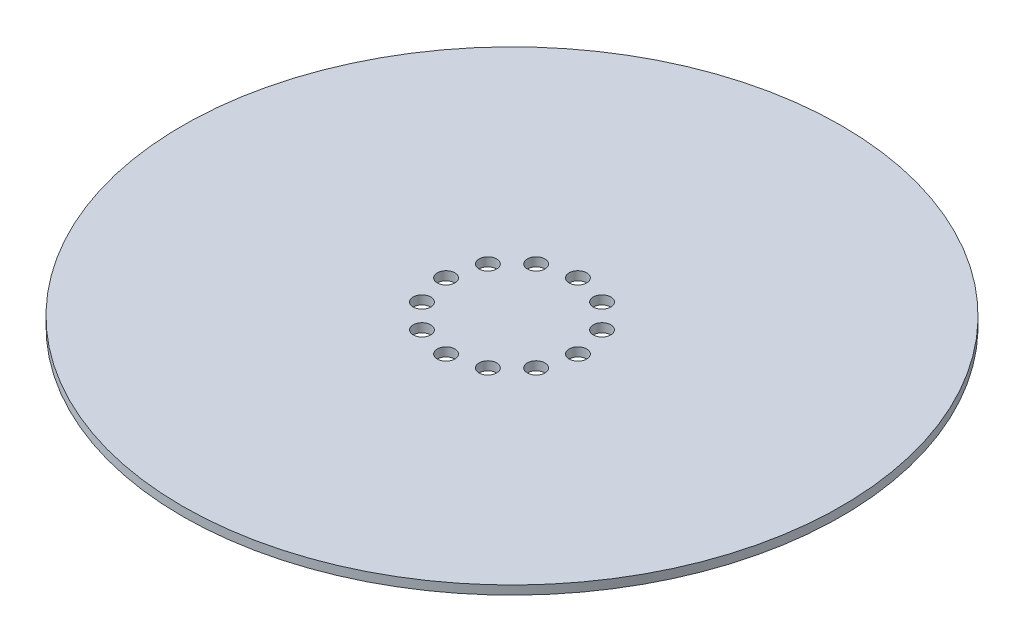
ISO-10303-21;
HEADER;
FILE_DESCRIPTION(('STEP AP214'),'2;1');
FILE_NAME('part.step','',(''),(''),'','','');
FILE_SCHEMA(('AUTOMOTIVE_DESIGN { 1 0 10303 214 1 1 1 1 }'));
ENDSEC;
DATA;
#1=APPLICATION_CONTEXT('core data for automotive mechanical design processes');
#2=APPLICATION_PROTOCOL_DEFINITION('international standard','automotive_design',2000,#1);
#3=PRODUCT_CONTEXT('',#1,'mechanical');
#4=PRODUCT('Part','Part','',(#3));
#5=PRODUCT_RELATED_PRODUCT_CATEGORY('part','',(#4));
#6=PRODUCT_DEFINITION_FORMATION('','',#4);
#7=PRODUCT_DEFINITION_CONTEXT('part definition',#1,'design');
#8=PRODUCT_DEFINITION('design','',#6,#7);
#9=PRODUCT_DEFINITION_SHAPE('','',#8);
#10=(LENGTH_UNIT() NAMED_UNIT(*) SI_UNIT(.MILLI.,.METRE.));
#11=(NAMED_UNIT(*) PLANE_ANGLE_UNIT() SI_UNIT($,.RADIAN.));
#12=(NAMED_UNIT(*) SI_UNIT($,.STERADIAN.) SOLID_ANGLE_UNIT());
#13=UNCERTAINTY_MEASURE_WITH_UNIT(LENGTH_MEASURE(1.E-05),#10,'distance_accuracy_value','');
#14=(GEOMETRIC_REPRESENTATION_CONTEXT(3) GLOBAL_UNCERTAINTY_ASSIGNED_CONTEXT((#13)) GLOBAL_UNIT_ASSIGNED_CONTEXT((#10,
#11,#12)) REPRESENTATION_CONTEXT('',''));
#15=CARTESIAN_POINT('',(0.,0.,0.));
#16=DIRECTION('',(0.,0.,1.));
#17=DIRECTION('',(1.,0.,0.));
#18=AXIS2_PLACEMENT_3D('',#15,#16,#17);
#19=CARTESIAN_POINT('',(0.,8.,0.));
#20=DIRECTION('',(0.,-1.,0.));
#21=DIRECTION('',(0.,0.,-1.));
#22=AXIS2_PLACEMENT_3D('',#19,#20,#21);
#23=CYLINDRICAL_SURFACE('',#22,300.);
#24=CARTESIAN_POINT('',(0.,8.,0.));
#25=DIRECTION('',(0.,1.,0.));
#26=DIRECTION('',(0.,0.,1.));
#27=AXIS2_PLACEMENT_3D('',#24,#25,#26);
#28=CIRCLE('',#27,300.);
#29=CARTESIAN_POINT('',(0.,8.,300.));
#30=VERTEX_POINT('',#29);
#31=EDGE_CURVE('E11',#30,#30,#28,.T.);
#32=ORIENTED_EDGE('',*,*,#31,.F.);
#33=EDGE_LOOP('',(#32));
#34=FACE_BOUND('',#33,.T.);
#35=CARTESIAN_POINT('',(0.,0.,0.));
#36=DIRECTION('',(0.,1.,0.));
#37=DIRECTION('',(0.,0.,1.));
#38=AXIS2_PLACEMENT_3D('',#35,#36,#37);
#39=CIRCLE('',#38,300.);
#40=CARTESIAN_POINT('',(0.,0.,300.));
#41=VERTEX_POINT('',#40);
#42=EDGE_CURVE('E36',#41,#41,#39,.T.);
#43=ORIENTED_EDGE('',*,*,#42,.T.);
#44=EDGE_LOOP('',(#43));
#45=FACE_BOUND('',#44,.T.);
#46=ADVANCED_FACE('F33',(#34,#45),#23,.T.);
#47=CARTESIAN_POINT('',(0.,8.,0.));
#48=DIRECTION('',(0.,1.,0.));
#49=DIRECTION('',(0.,0.,1.));
#50=AXIS2_PLACEMENT_3D('',#47,#48,#49);
#51=PLANE('',#50);
#52=CARTESIAN_POINT('',(-51.9615242270625,8.,-30.0000000000022));
#53=DIRECTION('',(0.,-1.,0.));
#54=DIRECTION('',(0.,0.,-1.));
#55=AXIS2_PLACEMENT_3D('',#52,#53,#54);
#56=CIRCLE('',#55,8.);
#57=CARTESIAN_POINT('',(-51.9615242270625,8.,-38.0000000000022));
#58=VERTEX_POINT('',#57);
#59=EDGE_CURVE('E108',#58,#58,#56,.T.);
#60=ORIENTED_EDGE('',*,*,#59,.T.);
#61=EDGE_LOOP('',(#60));
#62=FACE_BOUND('',#61,.T.);
#63=CARTESIAN_POINT('',(-29.9999999999952,8.,-51.9615242270676));
#64=DIRECTION('',(0.,-1.,0.));
#65=DIRECTION('',(0.,0.,-1.));
#66=AXIS2_PLACEMENT_3D('',#63,#64,#65);
#67=CIRCLE('',#66,8.);
#68=CARTESIAN_POINT('',(-29.9999999999952,8.,-59.9615242270676));
#69=VERTEX_POINT('',#68);
#70=EDGE_CURVE('E116',#69,#69,#67,.T.);
#71=ORIENTED_EDGE('',*,*,#70,.T.);
#72=EDGE_LOOP('',(#71));
#73=FACE_BOUND('',#72,.T.);
#74=CARTESIAN_POINT('',(5.10121193588295E-12,8.,-60.));
#75=DIRECTION('',(0.,-1.,0.));
#76=DIRECTION('',(0.,0.,-1.));
#77=AXIS2_PLACEMENT_3D('',#74,#75,#76);
#78=CIRCLE('',#77,8.);
#79=CARTESIAN_POINT('',(5.10121193588295E-12,8.,-68.));
#80=VERTEX_POINT('',#79);
#81=EDGE_CURVE('E122',#80,#80,#78,.T.);
#82=ORIENTED_EDGE('',*,*,#81,.T.);
#83=EDGE_LOOP('',(#82));
#84=FACE_BOUND('',#83,.T.);
#85=CARTESIAN_POINT('',(30.0000000000048,8.,-51.961524227065));
#86=DIRECTION('',(0.,-1.,0.));
#87=DIRECTION('',(0.,0.,-1.));
#88=AXIS2_PLACEMENT_3D('',#85,#86,#87);
#89=CIRCLE('',#88,8.);
#90=CARTESIAN_POINT('',(30.0000000000048,8.,-59.961524227065));
#91=VERTEX_POINT('',#90);
#92=EDGE_CURVE('E68',#91,#91,#89,.T.);
#93=ORIENTED_EDGE('',*,*,#92,.T.);
#94=EDGE_LOOP('',(#93));
#95=FACE_BOUND('',#94,.T.);
#96=CARTESIAN_POINT('',(51.9615242270702,8.,-29.9999999999978));
#97=DIRECTION('',(0.,-1.,0.));
#98=DIRECTION('',(0.,0.,-1.));
#99=AXIS2_PLACEMENT_3D('',#96,#97,#98);
#100=CIRCLE('',#99,8.);
#101=CARTESIAN_POINT('',(51.9615242270702,8.,-37.9999999999978));
#102=VERTEX_POINT('',#101);
#103=EDGE_CURVE('E81',#102,#102,#100,.T.);
#104=ORIENTED_EDGE('',*,*,#103,.T.);
#105=EDGE_LOOP('',(#104));
#106=FACE_BOUND('',#105,.T.);
#107=CARTESIAN_POINT('',(60.0000000000025,8.,2.55060596794148E-12));
#108=DIRECTION('',(0.,-1.,0.));
#109=DIRECTION('',(0.,0.,-1.));
#110=AXIS2_PLACEMENT_3D('',#107,#108,#109);
#111=CIRCLE('',#110,8.00000000000001);
#112=CARTESIAN_POINT('',(60.0000000000025,8.,-7.99999999999746));
#113=VERTEX_POINT('',#112);
#114=EDGE_CURVE('E87',#113,#113,#111,.T.);
#115=ORIENTED_EDGE('',*,*,#114,.T.);
#116=EDGE_LOOP('',(#115));
#117=FACE_BOUND('',#116,.T.);
#118=CARTESIAN_POINT('',(51.9615242270676,8.,30.0000000000022));
#119=DIRECTION('',(0.,-1.,0.));
#120=DIRECTION('',(0.,0.,-1.));
#121=AXIS2_PLACEMENT_3D('',#118,#119,#120);
#122=CIRCLE('',#121,8.);
#123=CARTESIAN_POINT('',(51.9615242270676,8.,22.0000000000022));
#124=VERTEX_POINT('',#123);
#125=EDGE_CURVE('E94',#124,#124,#122,.T.);
#126=ORIENTED_EDGE('',*,*,#125,.T.);
#127=EDGE_LOOP('',(#126));
#128=FACE_BOUND('',#127,.T.);
#129=CARTESIAN_POINT('',(30.0000000000001,8.,51.9615242270663));
#130=DIRECTION('',(0.,-1.,0.));
#131=DIRECTION('',(0.,0.,-1.));
#132=AXIS2_PLACEMENT_3D('',#129,#130,#131);
#133=CIRCLE('',#132,8.);
#134=CARTESIAN_POINT('',(30.0000000000001,8.,43.9615242270663));
#135=VERTEX_POINT('',#134);
#136=EDGE_CURVE('E48',#135,#135,#133,.T.);
#137=ORIENTED_EDGE('',*,*,#136,.T.);
#138=EDGE_LOOP('',(#137));
#139=FACE_BOUND('',#138,.T.);
#140=CARTESIAN_POINT('',(-59.9999999999974,8.,-2.55795384873636E-12));
#141=DIRECTION('',(0.,-1.,0.));
#142=DIRECTION('',(0.,0.,-1.));
#143=AXIS2_PLACEMENT_3D('',#140,#141,#142);
#144=CIRCLE('',#143,8.);
#145=CARTESIAN_POINT('',(-59.9999999999974,8.,-8.00000000000256));
#146=VERTEX_POINT('',#145);
#147=EDGE_CURVE('E109',#146,#146,#144,.T.);
#148=ORIENTED_EDGE('',*,*,#147,.T.);
#149=EDGE_LOOP('',(#148));
#150=FACE_BOUND('',#149,.T.);
#151=CARTESIAN_POINT('',(-51.9615242270651,8.,29.9999999999978));
#152=DIRECTION('',(0.,-1.,0.));
#153=DIRECTION('',(0.,0.,-1.));
#154=AXIS2_PLACEMENT_3D('',#151,#152,#153);
#155=CIRCLE('',#154,8.);
#156=CARTESIAN_POINT('',(-51.9615242270651,8.,21.9999999999978));
#157=VERTEX_POINT('',#156);
#158=EDGE_CURVE('E222',#157,#157,#155,.T.);
#159=ORIENTED_EDGE('',*,*,#158,.T.);
#160=EDGE_LOOP('',(#159));
#161=FACE_BOUND('',#160,.T.);
#162=CARTESIAN_POINT('',(-29.9999999999997,8.,51.961524227065));
#163=DIRECTION('',(0.,-1.,0.));
#164=DIRECTION('',(0.,0.,-1.));
#165=AXIS2_PLACEMENT_3D('',#162,#163,#164);
#166=CIRCLE('',#165,8.);
#167=CARTESIAN_POINT('',(-29.9999999999997,8.,43.961524227065));
#168=VERTEX_POINT('',#167);
#169=EDGE_CURVE('E59',#168,#168,#166,.T.);
#170=ORIENTED_EDGE('',*,*,#169,.T.);
#171=EDGE_LOOP('',(#170));
#172=FACE_BOUND('',#171,.T.);
#173=CARTESIAN_POINT('',(0.,8.,60.));
#174=DIRECTION('',(0.,-1.,0.));
#175=DIRECTION('',(0.,0.,-1.));
#176=AXIS2_PLACEMENT_3D('',#173,#174,#175);
#177=CIRCLE('',#176,8.);
#178=CARTESIAN_POINT('',(0.,8.,52.));
#179=VERTEX_POINT('',#178);
#180=EDGE_CURVE('E42',#179,#179,#177,.T.);
#181=ORIENTED_EDGE('',*,*,#180,.T.);
#182=EDGE_LOOP('',(#181));
#183=FACE_BOUND('',#182,.T.);
#184=ORIENTED_EDGE('',*,*,#31,.T.);
#185=EDGE_LOOP('',(#184));
#186=FACE_BOUND('',#185,.T.);
#187=ADVANCED_FACE('F136',(#62,#73,#84,#95,#106,#117,#128,#139,#150,#161,#172,#183,#186),#51,.T.);
#188=CARTESIAN_POINT('',(0.,0.,0.));
#189=DIRECTION('',(0.,1.,0.));
#190=DIRECTION('',(0.,0.,1.));
#191=AXIS2_PLACEMENT_3D('',#188,#189,#190);
#192=PLANE('',#191);
#193=CARTESIAN_POINT('',(-51.9615242270625,0.,-30.0000000000022));
#194=DIRECTION('',(0.,-1.,0.));
#195=DIRECTION('',(0.,0.,-1.));
#196=AXIS2_PLACEMENT_3D('',#193,#194,#195);
#197=CIRCLE('',#196,8.);
#198=CARTESIAN_POINT('',(-51.9615242270625,0.,-38.0000000000022));
#199=VERTEX_POINT('',#198);
#200=EDGE_CURVE('E105',#199,#199,#197,.T.);
#201=ORIENTED_EDGE('',*,*,#200,.F.);
#202=EDGE_LOOP('',(#201));
#203=FACE_BOUND('',#202,.T.);
#204=CARTESIAN_POINT('',(-29.9999999999952,0.,-51.9615242270676));
#205=DIRECTION('',(0.,-1.,0.));
#206=DIRECTION('',(0.,0.,-1.));
#207=AXIS2_PLACEMENT_3D('',#204,#205,#206);
#208=CIRCLE('',#207,8.);
#209=CARTESIAN_POINT('',(-29.9999999999952,0.,-59.9615242270676));
#210=VERTEX_POINT('',#209);
#211=EDGE_CURVE('E113',#210,#210,#208,.T.);
#212=ORIENTED_EDGE('',*,*,#211,.F.);
#213=EDGE_LOOP('',(#212));
#214=FACE_BOUND('',#213,.T.);
#215=CARTESIAN_POINT('',(5.10121193588295E-12,0.,-60.));
#216=DIRECTION('',(0.,-1.,0.));
#217=DIRECTION('',(0.,0.,-1.));
#218=AXIS2_PLACEMENT_3D('',#215,#216,#217);
#219=CIRCLE('',#218,8.);
#220=CARTESIAN_POINT('',(5.10121193588295E-12,0.,-68.));
#221=VERTEX_POINT('',#220);
#222=EDGE_CURVE('E120',#221,#221,#219,.T.);
#223=ORIENTED_EDGE('',*,*,#222,.F.);
#224=EDGE_LOOP('',(#223));
#225=FACE_BOUND('',#224,.T.);
#226=CARTESIAN_POINT('',(30.0000000000048,0.,-51.961524227065));
#227=DIRECTION('',(0.,-1.,0.));
#228=DIRECTION('',(0.,0.,-1.));
#229=AXIS2_PLACEMENT_3D('',#226,#227,#228);
#230=CIRCLE('',#229,8.);
#231=CARTESIAN_POINT('',(30.0000000000048,0.,-59.961524227065));
#232=VERTEX_POINT('',#231);
#233=EDGE_CURVE('E72',#232,#232,#230,.T.);
#234=ORIENTED_EDGE('',*,*,#233,.F.);
#235=EDGE_LOOP('',(#234));
#236=FACE_BOUND('',#235,.T.);
#237=CARTESIAN_POINT('',(51.9615242270702,0.,-29.9999999999978));
#238=DIRECTION('',(0.,-1.,0.));
#239=DIRECTION('',(0.,0.,-1.));
#240=AXIS2_PLACEMENT_3D('',#237,#238,#239);
#241=CIRCLE('',#240,8.);
#242=CARTESIAN_POINT('',(51.9615242270702,0.,-37.9999999999978));
#243=VERTEX_POINT('',#242);
#244=EDGE_CURVE('E52',#243,#243,#241,.T.);
#245=ORIENTED_EDGE('',*,*,#244,.F.);
#246=EDGE_LOOP('',(#245));
#247=FACE_BOUND('',#246,.T.);
#248=CARTESIAN_POINT('',(60.0000000000025,0.,2.55060596794148E-12));
#249=DIRECTION('',(0.,-1.,0.));
#250=DIRECTION('',(0.,0.,-1.));
#251=AXIS2_PLACEMENT_3D('',#248,#249,#250);
#252=CIRCLE('',#251,8.00000000000001);
#253=CARTESIAN_POINT('',(60.0000000000025,0.,-7.99999999999746));
#254=VERTEX_POINT('',#253);
#255=EDGE_CURVE('E85',#254,#254,#252,.T.);
#256=ORIENTED_EDGE('',*,*,#255,.F.);
#257=EDGE_LOOP('',(#256));
#258=FACE_BOUND('',#257,.T.);
#259=CARTESIAN_POINT('',(51.9615242270676,0.,30.0000000000022));
#260=DIRECTION('',(0.,-1.,0.));
#261=DIRECTION('',(0.,0.,-1.));
#262=AXIS2_PLACEMENT_3D('',#259,#260,#261);
#263=CIRCLE('',#262,8.);
#264=CARTESIAN_POINT('',(51.9615242270676,0.,22.0000000000022));
#265=VERTEX_POINT('',#264);
#266=EDGE_CURVE('E91',#265,#265,#263,.T.);
#267=ORIENTED_EDGE('',*,*,#266,.F.);
#268=EDGE_LOOP('',(#267));
#269=FACE_BOUND('',#268,.T.);
#270=CARTESIAN_POINT('',(30.0000000000001,0.,51.9615242270663));
#271=DIRECTION('',(0.,-1.,0.));
#272=DIRECTION('',(0.,0.,-1.));
#273=AXIS2_PLACEMENT_3D('',#270,#271,#272);
#274=CIRCLE('',#273,8.);
#275=CARTESIAN_POINT('',(30.0000000000001,0.,43.9615242270663));
#276=VERTEX_POINT('',#275);
#277=EDGE_CURVE('E98',#276,#276,#274,.T.);
#278=ORIENTED_EDGE('',*,*,#277,.F.);
#279=EDGE_LOOP('',(#278));
#280=FACE_BOUND('',#279,.T.);
#281=CARTESIAN_POINT('',(-59.9999999999974,0.,-2.55795384873636E-12));
#282=DIRECTION('',(0.,-1.,0.));
#283=DIRECTION('',(0.,0.,-1.));
#284=AXIS2_PLACEMENT_3D('',#281,#282,#283);
#285=CIRCLE('',#284,8.);
#286=CARTESIAN_POINT('',(-59.9999999999974,0.,-8.00000000000256));
#287=VERTEX_POINT('',#286);
#288=EDGE_CURVE('E151',#287,#287,#285,.T.);
#289=ORIENTED_EDGE('',*,*,#288,.F.);
#290=EDGE_LOOP('',(#289));
#291=FACE_BOUND('',#290,.T.);
#292=CARTESIAN_POINT('',(-51.9615242270651,0.,29.9999999999978));
#293=DIRECTION('',(0.,-1.,0.));
#294=DIRECTION('',(0.,0.,-1.));
#295=AXIS2_PLACEMENT_3D('',#292,#293,#294);
#296=CIRCLE('',#295,8.);
#297=CARTESIAN_POINT('',(-51.9615242270651,0.,21.9999999999978));
#298=VERTEX_POINT('',#297);
#299=EDGE_CURVE('E64',#298,#298,#296,.T.);
#300=ORIENTED_EDGE('',*,*,#299,.F.);
#301=EDGE_LOOP('',(#300));
#302=FACE_BOUND('',#301,.T.);
#303=CARTESIAN_POINT('',(-29.9999999999997,0.,51.961524227065));
#304=DIRECTION('',(0.,-1.,0.));
#305=DIRECTION('',(0.,0.,-1.));
#306=AXIS2_PLACEMENT_3D('',#303,#304,#305);
#307=CIRCLE('',#306,8.);
#308=CARTESIAN_POINT('',(-29.9999999999997,0.,43.961524227065));
#309=VERTEX_POINT('',#308);
#310=EDGE_CURVE('E65',#309,#309,#307,.T.);
#311=ORIENTED_EDGE('',*,*,#310,.F.);
#312=EDGE_LOOP('',(#311));
#313=FACE_BOUND('',#312,.T.);
#314=CARTESIAN_POINT('',(0.,0.,60.));
#315=DIRECTION('',(0.,-1.,0.));
#316=DIRECTION('',(0.,0.,-1.));
#317=AXIS2_PLACEMENT_3D('',#314,#315,#316);
#318=CIRCLE('',#317,8.);
#319=CARTESIAN_POINT('',(0.,0.,52.));
#320=VERTEX_POINT('',#319);
#321=EDGE_CURVE('E45',#320,#320,#318,.T.);
#322=ORIENTED_EDGE('',*,*,#321,.F.);
#323=EDGE_LOOP('',(#322));
#324=FACE_BOUND('',#323,.T.);
#325=ORIENTED_EDGE('',*,*,#42,.F.);
#326=EDGE_LOOP('',(#325));
#327=FACE_BOUND('',#326,.T.);
#328=ADVANCED_FACE('F132',(#203,#214,#225,#236,#247,#258,#269,#280,#291,#302,#313,#324,#327),
#192,.F.);
#329=CARTESIAN_POINT('',(0.,8.,60.));
#330=DIRECTION('',(0.,-1.,0.));
#331=DIRECTION('',(0.,0.,-1.));
#332=AXIS2_PLACEMENT_3D('',#329,#330,#331);
#333=CYLINDRICAL_SURFACE('',#332,8.);
#334=ORIENTED_EDGE('',*,*,#180,.F.);
#335=EDGE_LOOP('',(#334));
#336=FACE_BOUND('',#335,.T.);
#337=ORIENTED_EDGE('',*,*,#321,.T.);
#338=EDGE_LOOP('',(#337));
#339=FACE_BOUND('',#338,.T.);
#340=ADVANCED_FACE('F135',(#336,#339),#333,.F.);
#341=CARTESIAN_POINT('',(-29.9999999999997,8.,51.961524227065));
#342=DIRECTION('',(0.,-1.,0.));
#343=DIRECTION('',(0.,0.,-1.));
#344=AXIS2_PLACEMENT_3D('',#341,#342,#343);
#345=CYLINDRICAL_SURFACE('',#344,8.);
#346=ORIENTED_EDGE('',*,*,#169,.F.);
#347=EDGE_LOOP('',(#346));
#348=FACE_BOUND('',#347,.T.);
#349=ORIENTED_EDGE('',*,*,#310,.T.);
#350=EDGE_LOOP('',(#349));
#351=FACE_BOUND('',#350,.T.);
#352=ADVANCED_FACE('F174',(#348,#351),#345,.F.);
#353=CARTESIAN_POINT('',(-51.9615242270651,8.,29.9999999999978));
#354=DIRECTION('',(0.,-1.,0.));
#355=DIRECTION('',(0.,0.,-1.));
#356=AXIS2_PLACEMENT_3D('',#353,#354,#355);
#357=CYLINDRICAL_SURFACE('',#356,8.);
#358=ORIENTED_EDGE('',*,*,#158,.F.);
#359=EDGE_LOOP('',(#358));
#360=FACE_BOUND('',#359,.T.);
#361=ORIENTED_EDGE('',*,*,#299,.T.);
#362=EDGE_LOOP('',(#361));
#363=FACE_BOUND('',#362,.T.);
#364=ADVANCED_FACE('F210',(#360,#363),#357,.F.);
#365=CARTESIAN_POINT('',(-59.9999999999974,8.,-2.55795384873636E-12));
#366=DIRECTION('',(0.,-1.,0.));
#367=DIRECTION('',(0.,0.,-1.));
#368=AXIS2_PLACEMENT_3D('',#365,#366,#367);
#369=CYLINDRICAL_SURFACE('',#368,8.);
#370=ORIENTED_EDGE('',*,*,#147,.F.);
#371=EDGE_LOOP('',(#370));
#372=FACE_BOUND('',#371,.T.);
#373=ORIENTED_EDGE('',*,*,#288,.T.);
#374=EDGE_LOOP('',(#373));
#375=FACE_BOUND('',#374,.T.);
#376=ADVANCED_FACE('F191',(#372,#375),#369,.F.);
#377=CARTESIAN_POINT('',(30.0000000000001,8.,51.9615242270663));
#378=DIRECTION('',(0.,-1.,0.));
#379=DIRECTION('',(0.,0.,-1.));
#380=AXIS2_PLACEMENT_3D('',#377,#378,#379);
#381=CYLINDRICAL_SURFACE('',#380,8.);
#382=ORIENTED_EDGE('',*,*,#136,.F.);
#383=EDGE_LOOP('',(#382));
#384=FACE_BOUND('',#383,.T.);
#385=ORIENTED_EDGE('',*,*,#277,.T.);
#386=EDGE_LOOP('',(#385));
#387=FACE_BOUND('',#386,.T.);
#388=ADVANCED_FACE('F187',(#384,#387),#381,.F.);
#389=CARTESIAN_POINT('',(51.9615242270676,8.,30.0000000000022));
#390=DIRECTION('',(0.,-1.,0.));
#391=DIRECTION('',(0.,0.,-1.));
#392=AXIS2_PLACEMENT_3D('',#389,#390,#391);
#393=CYLINDRICAL_SURFACE('',#392,8.);
#394=ORIENTED_EDGE('',*,*,#125,.F.);
#395=EDGE_LOOP('',(#394));
#396=FACE_BOUND('',#395,.T.);
#397=ORIENTED_EDGE('',*,*,#266,.T.);
#398=EDGE_LOOP('',(#397));
#399=FACE_BOUND('',#398,.T.);
#400=ADVANCED_FACE('F183',(#396,#399),#393,.F.);
#401=CARTESIAN_POINT('',(60.0000000000025,8.,2.55060596794148E-12));
#402=DIRECTION('',(0.,-1.,0.));
#403=DIRECTION('',(0.,0.,-1.));
#404=AXIS2_PLACEMENT_3D('',#401,#402,#403);
#405=CYLINDRICAL_SURFACE('',#404,8.00000000000001);
#406=ORIENTED_EDGE('',*,*,#114,.F.);
#407=EDGE_LOOP('',(#406));
#408=FACE_BOUND('',#407,.T.);
#409=ORIENTED_EDGE('',*,*,#255,.T.);
#410=EDGE_LOOP('',(#409));
#411=FACE_BOUND('',#410,.T.);
#412=ADVANCED_FACE('F179',(#408,#411),#405,.F.);
#413=CARTESIAN_POINT('',(51.9615242270702,8.,-29.9999999999978));
#414=DIRECTION('',(0.,-1.,0.));
#415=DIRECTION('',(0.,0.,-1.));
#416=AXIS2_PLACEMENT_3D('',#413,#414,#415);
#417=CYLINDRICAL_SURFACE('',#416,8.);
#418=ORIENTED_EDGE('',*,*,#103,.F.);
#419=EDGE_LOOP('',(#418));
#420=FACE_BOUND('',#419,.T.);
#421=ORIENTED_EDGE('',*,*,#244,.T.);
#422=EDGE_LOOP('',(#421));
#423=FACE_BOUND('',#422,.T.);
#424=ADVANCED_FACE('F176',(#420,#423),#417,.F.);
#425=CARTESIAN_POINT('',(30.0000000000048,8.,-51.961524227065));
#426=DIRECTION('',(0.,-1.,0.));
#427=DIRECTION('',(0.,0.,-1.));
#428=AXIS2_PLACEMENT_3D('',#425,#426,#427);
#429=CYLINDRICAL_SURFACE('',#428,8.);
#430=ORIENTED_EDGE('',*,*,#92,.F.);
#431=EDGE_LOOP('',(#430));
#432=FACE_BOUND('',#431,.T.);
#433=ORIENTED_EDGE('',*,*,#233,.T.);
#434=EDGE_LOOP('',(#433));
#435=FACE_BOUND('',#434,.T.);
#436=ADVANCED_FACE('F130',(#432,#435),#429,.F.);
#437=CARTESIAN_POINT('',(5.10121193588295E-12,8.,-60.));
#438=DIRECTION('',(0.,-1.,0.));
#439=DIRECTION('',(0.,0.,-1.));
#440=AXIS2_PLACEMENT_3D('',#437,#438,#439);
#441=CYLINDRICAL_SURFACE('',#440,8.);
#442=ORIENTED_EDGE('',*,*,#81,.F.);
#443=EDGE_LOOP('',(#442));
#444=FACE_BOUND('',#443,.T.);
#445=ORIENTED_EDGE('',*,*,#222,.T.);
#446=EDGE_LOOP('',(#445));
#447=FACE_BOUND('',#446,.T.);
#448=ADVANCED_FACE('F200',(#444,#447),#441,.F.);
#449=CARTESIAN_POINT('',(-29.9999999999952,8.,-51.9615242270676));
#450=DIRECTION('',(0.,-1.,0.));
#451=DIRECTION('',(0.,0.,-1.));
#452=AXIS2_PLACEMENT_3D('',#449,#450,#451);
#453=CYLINDRICAL_SURFACE('',#452,8.);
#454=ORIENTED_EDGE('',*,*,#70,.F.);
#455=EDGE_LOOP('',(#454));
#456=FACE_BOUND('',#455,.T.);
#457=ORIENTED_EDGE('',*,*,#211,.T.);
#458=EDGE_LOOP('',(#457));
#459=FACE_BOUND('',#458,.T.);
#460=ADVANCED_FACE('F196',(#456,#459),#453,.F.);
#461=CARTESIAN_POINT('',(-51.9615242270625,8.,-30.0000000000022));
#462=DIRECTION('',(0.,-1.,0.));
#463=DIRECTION('',(0.,0.,-1.));
#464=AXIS2_PLACEMENT_3D('',#461,#462,#463);
#465=CYLINDRICAL_SURFACE('',#464,8.);
#466=ORIENTED_EDGE('',*,*,#59,.F.);
#467=EDGE_LOOP('',(#466));
#468=FACE_BOUND('',#467,.T.);
#469=ORIENTED_EDGE('',*,*,#200,.T.);
#470=EDGE_LOOP('',(#469));
#471=FACE_BOUND('',#470,.T.);
#472=ADVANCED_FACE('F193',(#468,#471),#465,.F.);
#473=CLOSED_SHELL('',(#46,#187,#328,#340,#352,#364,#376,#388,#400,#412,#424,#436,#448,#460,#472));
#474=MANIFOLD_SOLID_BREP('B2',#473);
#475=ADVANCED_BREP_SHAPE_REPRESENTATION('',(#18,#474),#14);
#476=SHAPE_DEFINITION_REPRESENTATION(#9,#475);
ENDSEC;
END-ISO-10303-21;
